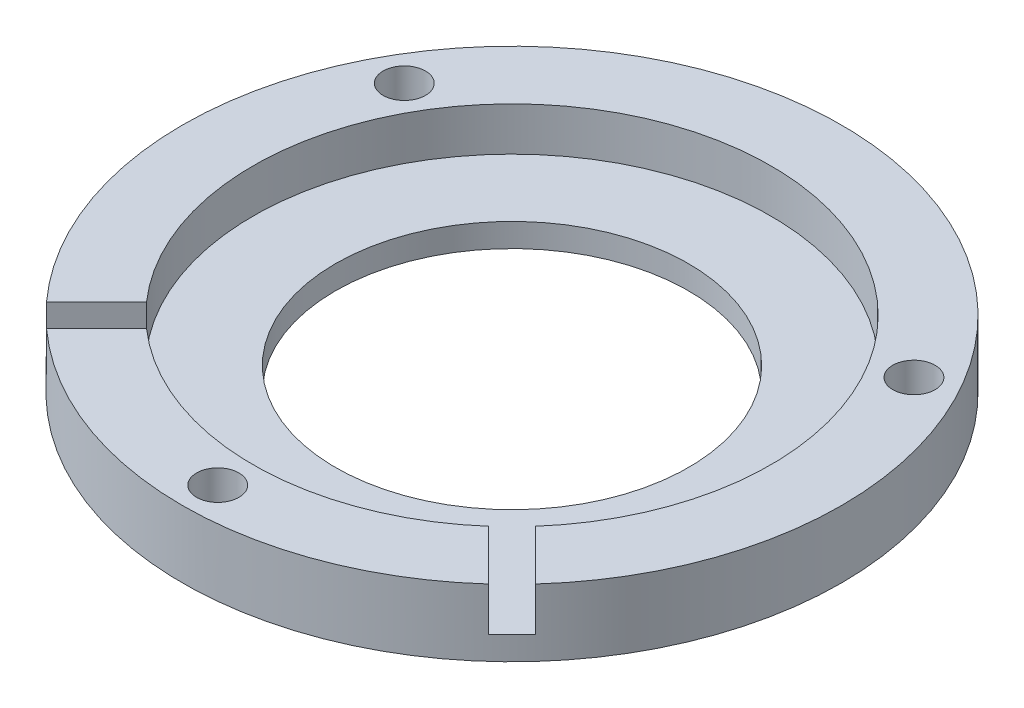
ISO-10303-21;
HEADER;
FILE_DESCRIPTION(('STEP AP214'),'2;1');
FILE_NAME('part.step','',(''),(''),'','','');
FILE_SCHEMA(('AUTOMOTIVE_DESIGN { 1 0 10303 214 1 1 1 1 }'));
ENDSEC;
DATA;
#1=APPLICATION_CONTEXT('core data for automotive mechanical design processes');
#2=APPLICATION_PROTOCOL_DEFINITION('international standard','automotive_design',2000,#1);
#3=PRODUCT_CONTEXT('',#1,'mechanical');
#4=PRODUCT('Part','Part','',(#3));
#5=PRODUCT_RELATED_PRODUCT_CATEGORY('part','',(#4));
#6=PRODUCT_DEFINITION_FORMATION('','',#4);
#7=PRODUCT_DEFINITION_CONTEXT('part definition',#1,'design');
#8=PRODUCT_DEFINITION('design','',#6,#7);
#9=PRODUCT_DEFINITION_SHAPE('','',#8);
#10=(LENGTH_UNIT() NAMED_UNIT(*) SI_UNIT(.MILLI.,.METRE.));
#11=(NAMED_UNIT(*) PLANE_ANGLE_UNIT() SI_UNIT($,.RADIAN.));
#12=(NAMED_UNIT(*) SI_UNIT($,.STERADIAN.) SOLID_ANGLE_UNIT());
#13=UNCERTAINTY_MEASURE_WITH_UNIT(LENGTH_MEASURE(1.E-05),#10,'distance_accuracy_value','');
#14=(GEOMETRIC_REPRESENTATION_CONTEXT(3) GLOBAL_UNCERTAINTY_ASSIGNED_CONTEXT((#13)) GLOBAL_UNIT_ASSIGNED_CONTEXT((#10,
#11,#12)) REPRESENTATION_CONTEXT('',''));
#15=CARTESIAN_POINT('',(0.,0.,0.));
#16=DIRECTION('',(0.,0.,1.));
#17=DIRECTION('',(1.,0.,0.));
#18=AXIS2_PLACEMENT_3D('',#15,#16,#17);
#19=CARTESIAN_POINT('',(0.,2.85,0.));
#20=DIRECTION('',(0.,-1.,0.));
#21=DIRECTION('',(1.,0.,0.));
#22=AXIS2_PLACEMENT_3D('',#19,#20,#21);
#23=PLANE('',#22);
#24=CARTESIAN_POINT('',(-10.8253175473055,2.85,-6.25000000000005));
#25=DIRECTION('',(0.,1.,0.));
#26=DIRECTION('',(-1.,0.,0.));
#27=AXIS2_PLACEMENT_3D('',#24,#25,#26);
#28=CIRCLE('',#27,0.899999999999999);
#29=CARTESIAN_POINT('',(-11.7253175473055,2.85,-6.25000000000005));
#30=VERTEX_POINT('',#29);
#31=EDGE_CURVE('E229',#30,#30,#28,.T.);
#32=ORIENTED_EDGE('',*,*,#31,.F.);
#33=EDGE_LOOP('',(#32));
#34=FACE_BOUND('',#33,.T.);
#35=CARTESIAN_POINT('',(10.8253175473055,2.85,-6.2499999999999));
#36=DIRECTION('',(0.,1.,0.));
#37=DIRECTION('',(-1.,0.,0.));
#38=AXIS2_PLACEMENT_3D('',#35,#36,#37);
#39=CIRCLE('',#38,0.9);
#40=CARTESIAN_POINT('',(9.92531754730554,2.85,-6.2499999999999));
#41=VERTEX_POINT('',#40);
#42=EDGE_CURVE('E226',#41,#41,#39,.T.);
#43=ORIENTED_EDGE('',*,*,#42,.F.);
#44=EDGE_LOOP('',(#43));
#45=FACE_BOUND('',#44,.T.);
#46=DIRECTION('',(0.70710678118655,0.,-0.707106781186545));
#47=VECTOR('',#46,1.);
#48=CARTESIAN_POINT('',(-0.494974746830598,2.85,-0.494974746830602));
#49=LINE('',#48,#47);
#50=CARTESIAN_POINT('',(-10.3820875711085,2.85,9.39213807744724));
#51=VERTEX_POINT('',#50);
#52=CARTESIAN_POINT('',(-8.25738416659199,2.85,7.26743467293074));
#53=VERTEX_POINT('',#52);
#54=EDGE_CURVE('E212',#51,#53,#49,.T.);
#55=ORIENTED_EDGE('',*,*,#54,.T.);
#56=CARTESIAN_POINT('',(0.,2.85,0.));
#57=DIRECTION('',(0.,1.,0.));
#58=DIRECTION('',(-1.,0.,0.));
#59=AXIS2_PLACEMENT_3D('',#56,#57,#58);
#60=CIRCLE('',#59,11.);
#61=CARTESIAN_POINT('',(8.25738416659194,2.85,7.2674346729308));
#62=VERTEX_POINT('',#61);
#63=EDGE_CURVE('E122',#62,#53,#60,.T.);
#64=ORIENTED_EDGE('',*,*,#63,.F.);
#65=DIRECTION('',(-0.707106781186546,0.,-0.707106781186549));
#66=VECTOR('',#65,1.);
#67=CARTESIAN_POINT('',(0.494974746830585,2.85,-0.494974746830583));
#68=LINE('',#67,#66);
#69=CARTESIAN_POINT('',(10.3820875711084,2.85,9.39213807744731));
#70=VERTEX_POINT('',#69);
#71=EDGE_CURVE('E187',#70,#62,#68,.T.);
#72=ORIENTED_EDGE('',*,*,#71,.F.);
#73=CARTESIAN_POINT('',(0.,2.85,0.));
#74=DIRECTION('',(0.,1.,0.));
#75=DIRECTION('',(-1.,0.,0.));
#76=AXIS2_PLACEMENT_3D('',#73,#74,#75);
#77=CIRCLE('',#76,14.);
#78=EDGE_CURVE('E133',#70,#51,#77,.T.);
#79=ORIENTED_EDGE('',*,*,#78,.T.);
#80=EDGE_LOOP('',(#55,#64,#72,#79));
#81=FACE_BOUND('',#80,.T.);
#82=ADVANCED_FACE('F35',(#34,#45,#81),#23,.F.);
#83=CARTESIAN_POINT('',(0.,0.999999999999999,0.));
#84=DIRECTION('',(0.,1.,0.));
#85=DIRECTION('',(-1.,0.,0.));
#86=AXIS2_PLACEMENT_3D('',#83,#84,#85);
#87=CYLINDRICAL_SURFACE('',#86,11.);
#88=DIRECTION('',(0.,1.,0.));
#89=VECTOR('',#88,1.);
#90=CARTESIAN_POINT('',(-8.25738416659199,-3.40478437068753,7.26743467293074));
#91=LINE('',#90,#89);
#92=CARTESIAN_POINT('',(-8.25738416659199,1.,7.26743467293074));
#93=VERTEX_POINT('',#92);
#94=EDGE_CURVE('E110',#93,#53,#91,.T.);
#95=ORIENTED_EDGE('',*,*,#94,.F.);
#96=CARTESIAN_POINT('',(0.,1.,0.));
#97=DIRECTION('',(0.,1.,0.));
#98=DIRECTION('',(-1.,0.,0.));
#99=AXIS2_PLACEMENT_3D('',#96,#97,#98);
#100=CIRCLE('',#99,11.);
#101=CARTESIAN_POINT('',(8.25738416659194,0.999999999999999,7.2674346729308));
#102=VERTEX_POINT('',#101);
#103=EDGE_CURVE('E123',#102,#93,#100,.T.);
#104=ORIENTED_EDGE('',*,*,#103,.F.);
#105=DIRECTION('',(0.,1.,0.));
#106=VECTOR('',#105,1.);
#107=CARTESIAN_POINT('',(8.25738416659194,-3.40478437068754,7.2674346729308));
#108=LINE('',#107,#106);
#109=EDGE_CURVE('E198',#102,#62,#108,.T.);
#110=ORIENTED_EDGE('',*,*,#109,.T.);
#111=ORIENTED_EDGE('',*,*,#63,.T.);
#112=EDGE_LOOP('',(#95,#104,#110,#111));
#113=FACE_BOUND('',#112,.T.);
#114=ADVANCED_FACE('F150',(#113),#87,.F.);
#115=CARTESIAN_POINT('',(0.,1.,0.));
#116=DIRECTION('',(0.,-1.,0.));
#117=DIRECTION('',(1.,0.,0.));
#118=AXIS2_PLACEMENT_3D('',#115,#116,#117);
#119=PLANE('',#118);
#120=CARTESIAN_POINT('',(0.,1.,0.));
#121=DIRECTION('',(0.,1.,0.));
#122=DIRECTION('',(-1.,0.,0.));
#123=AXIS2_PLACEMENT_3D('',#120,#121,#122);
#124=CIRCLE('',#123,7.5);
#125=CARTESIAN_POINT('',(-7.5,1.,0.));
#126=VERTEX_POINT('',#125);
#127=EDGE_CURVE('E11',#126,#126,#124,.T.);
#128=ORIENTED_EDGE('',*,*,#127,.F.);
#129=EDGE_LOOP('',(#128));
#130=FACE_BOUND('',#129,.T.);
#131=ORIENTED_EDGE('',*,*,#103,.T.);
#132=DIRECTION('',(0.70710678118655,0.,-0.707106781186545));
#133=VECTOR('',#132,1.);
#134=CARTESIAN_POINT('',(-0.494974746830598,1.,-0.494974746830602));
#135=LINE('',#134,#133);
#136=CARTESIAN_POINT('',(-10.3820875711085,1.,9.39213807744724));
#137=VERTEX_POINT('',#136);
#138=EDGE_CURVE('E58',#137,#93,#135,.T.);
#139=ORIENTED_EDGE('',*,*,#138,.F.);
#140=CARTESIAN_POINT('',(0.,1.,0.));
#141=DIRECTION('',(0.,-1.,0.));
#142=DIRECTION('',(1.,0.,0.));
#143=AXIS2_PLACEMENT_3D('',#140,#141,#142);
#144=CIRCLE('',#143,14.);
#145=CARTESIAN_POINT('',(-9.39213807744735,1.,10.3820875711084));
#146=VERTEX_POINT('',#145);
#147=EDGE_CURVE('E117',#137,#146,#144,.F.);
#148=ORIENTED_EDGE('',*,*,#147,.T.);
#149=DIRECTION('',(0.707106781186551,0.,-0.707106781186544));
#150=VECTOR('',#149,1.);
#151=CARTESIAN_POINT('',(0.494974746830581,1.,0.494974746830586));
#152=LINE('',#151,#150);
#153=CARTESIAN_POINT('',(-7.26743467293083,1.,8.25738416659192));
#154=VERTEX_POINT('',#153);
#155=EDGE_CURVE('E102',#146,#154,#152,.T.);
#156=ORIENTED_EDGE('',*,*,#155,.T.);
#157=CARTESIAN_POINT('',(7.26743467293077,1.,8.25738416659196));
#158=VERTEX_POINT('',#157);
#159=EDGE_CURVE('E115',#154,#158,#100,.T.);
#160=ORIENTED_EDGE('',*,*,#159,.T.);
#161=DIRECTION('',(-0.707106781186546,0.,-0.707106781186549));
#162=VECTOR('',#161,1.);
#163=CARTESIAN_POINT('',(-0.494974746830584,1.,0.494974746830582));
#164=LINE('',#163,#162);
#165=CARTESIAN_POINT('',(9.39213807744728,0.999999999999999,10.3820875711085));
#166=VERTEX_POINT('',#165);
#167=EDGE_CURVE('E50',#166,#158,#164,.T.);
#168=ORIENTED_EDGE('',*,*,#167,.F.);
#169=CARTESIAN_POINT('',(0.,1.,0.));
#170=DIRECTION('',(0.,-1.,0.));
#171=DIRECTION('',(1.,0.,0.));
#172=AXIS2_PLACEMENT_3D('',#169,#170,#171);
#173=CIRCLE('',#172,14.);
#174=CARTESIAN_POINT('',(10.3820875711084,0.999999999999999,9.39213807744731));
#175=VERTEX_POINT('',#174);
#176=EDGE_CURVE('E189',#166,#175,#173,.F.);
#177=ORIENTED_EDGE('',*,*,#176,.T.);
#178=DIRECTION('',(-0.707106781186546,0.,-0.707106781186549));
#179=VECTOR('',#178,1.);
#180=CARTESIAN_POINT('',(0.494974746830585,1.,-0.494974746830583));
#181=LINE('',#180,#179);
#182=EDGE_CURVE('E195',#175,#102,#181,.T.);
#183=ORIENTED_EDGE('',*,*,#182,.T.);
#184=EDGE_LOOP('',(#131,#139,#148,#156,#160,#168,#177,#183));
#185=FACE_BOUND('',#184,.T.);
#186=ADVANCED_FACE('F37',(#130,#185),#119,.F.);
#187=CARTESIAN_POINT('',(0.,0.999999999999999,0.));
#188=DIRECTION('',(0.,1.,0.));
#189=DIRECTION('',(-1.,0.,0.));
#190=AXIS2_PLACEMENT_3D('',#187,#188,#189);
#191=CYLINDRICAL_SURFACE('',#190,7.5);
#192=CARTESIAN_POINT('',(0.,0.,0.));
#193=DIRECTION('',(0.,1.,0.));
#194=DIRECTION('',(-1.,0.,0.));
#195=AXIS2_PLACEMENT_3D('',#192,#193,#194);
#196=CIRCLE('',#195,7.5);
#197=CARTESIAN_POINT('',(-7.5,0.,0.));
#198=VERTEX_POINT('',#197);
#199=EDGE_CURVE('E43',#198,#198,#196,.T.);
#200=ORIENTED_EDGE('',*,*,#199,.F.);
#201=EDGE_LOOP('',(#200));
#202=FACE_BOUND('',#201,.T.);
#203=ORIENTED_EDGE('',*,*,#127,.T.);
#204=EDGE_LOOP('',(#203));
#205=FACE_BOUND('',#204,.T.);
#206=ADVANCED_FACE('F144',(#202,#205),#191,.F.);
#207=CARTESIAN_POINT('',(0.,0.,0.));
#208=DIRECTION('',(0.,1.,0.));
#209=DIRECTION('',(-1.,0.,0.));
#210=AXIS2_PLACEMENT_3D('',#207,#208,#209);
#211=PLANE('',#210);
#212=CARTESIAN_POINT('',(-10.8253175473055,0.,-6.25000000000005));
#213=DIRECTION('',(0.,1.,0.));
#214=DIRECTION('',(-1.,0.,0.));
#215=AXIS2_PLACEMENT_3D('',#212,#213,#214);
#216=CIRCLE('',#215,0.899999999999999);
#217=CARTESIAN_POINT('',(-11.7253175473055,0.,-6.25000000000005));
#218=VERTEX_POINT('',#217);
#219=EDGE_CURVE('E194',#218,#218,#216,.T.);
#220=ORIENTED_EDGE('',*,*,#219,.T.);
#221=EDGE_LOOP('',(#220));
#222=FACE_BOUND('',#221,.T.);
#223=CARTESIAN_POINT('',(10.8253175473055,0.,-6.2499999999999));
#224=DIRECTION('',(0.,1.,0.));
#225=DIRECTION('',(-1.,0.,0.));
#226=AXIS2_PLACEMENT_3D('',#223,#224,#225);
#227=CIRCLE('',#226,0.9);
#228=CARTESIAN_POINT('',(9.92531754730554,0.,-6.2499999999999));
#229=VERTEX_POINT('',#228);
#230=EDGE_CURVE('E223',#229,#229,#227,.T.);
#231=ORIENTED_EDGE('',*,*,#230,.T.);
#232=EDGE_LOOP('',(#231));
#233=FACE_BOUND('',#232,.T.);
#234=CARTESIAN_POINT('',(0.,0.,12.5));
#235=DIRECTION('',(0.,1.,0.));
#236=DIRECTION('',(-1.,0.,0.));
#237=AXIS2_PLACEMENT_3D('',#234,#235,#236);
#238=CIRCLE('',#237,0.9);
#239=CARTESIAN_POINT('',(-0.899999999999998,0.,12.5));
#240=VERTEX_POINT('',#239);
#241=EDGE_CURVE('E219',#240,#240,#238,.T.);
#242=ORIENTED_EDGE('',*,*,#241,.T.);
#243=EDGE_LOOP('',(#242));
#244=FACE_BOUND('',#243,.T.);
#245=CARTESIAN_POINT('',(0.,0.,0.));
#246=DIRECTION('',(0.,1.,0.));
#247=DIRECTION('',(-1.,0.,0.));
#248=AXIS2_PLACEMENT_3D('',#245,#246,#247);
#249=CIRCLE('',#248,14.);
#250=CARTESIAN_POINT('',(-14.,0.,0.));
#251=VERTEX_POINT('',#250);
#252=EDGE_CURVE('E137',#251,#251,#249,.T.);
#253=ORIENTED_EDGE('',*,*,#252,.F.);
#254=EDGE_LOOP('',(#253));
#255=FACE_BOUND('',#254,.T.);
#256=ORIENTED_EDGE('',*,*,#199,.T.);
#257=EDGE_LOOP('',(#256));
#258=FACE_BOUND('',#257,.T.);
#259=ADVANCED_FACE('F142',(#222,#233,#244,#255,#258),#211,.F.);
#260=CARTESIAN_POINT('',(0.,0.999999999999999,0.));
#261=DIRECTION('',(0.,1.,0.));
#262=DIRECTION('',(-1.,0.,0.));
#263=AXIS2_PLACEMENT_3D('',#260,#261,#262);
#264=CYLINDRICAL_SURFACE('',#263,14.);
#265=CARTESIAN_POINT('',(-9.39213807744735,2.85,10.3820875711084));
#266=VERTEX_POINT('',#265);
#267=CARTESIAN_POINT('',(9.39213807744728,2.85,10.3820875711085));
#268=VERTEX_POINT('',#267);
#269=EDGE_CURVE('E136',#266,#268,#77,.T.);
#270=ORIENTED_EDGE('',*,*,#269,.F.);
#271=DIRECTION('',(0.,1.,0.));
#272=VECTOR('',#271,1.);
#273=CARTESIAN_POINT('',(-9.39213807744735,-3.40478437068753,10.3820875711084));
#274=LINE('',#273,#272);
#275=EDGE_CURVE('E128',#146,#266,#274,.T.);
#276=ORIENTED_EDGE('',*,*,#275,.F.);
#277=ORIENTED_EDGE('',*,*,#147,.F.);
#278=DIRECTION('',(0.,1.,0.));
#279=VECTOR('',#278,1.);
#280=CARTESIAN_POINT('',(-10.3820875711085,-3.40478437068753,9.39213807744724));
#281=LINE('',#280,#279);
#282=EDGE_CURVE('E211',#137,#51,#281,.T.);
#283=ORIENTED_EDGE('',*,*,#282,.T.);
#284=ORIENTED_EDGE('',*,*,#78,.F.);
#285=DIRECTION('',(0.,1.,0.));
#286=VECTOR('',#285,1.);
#287=CARTESIAN_POINT('',(10.3820875711084,-3.40478437068754,9.39213807744731));
#288=LINE('',#287,#286);
#289=EDGE_CURVE('E192',#175,#70,#288,.T.);
#290=ORIENTED_EDGE('',*,*,#289,.F.);
#291=ORIENTED_EDGE('',*,*,#176,.F.);
#292=DIRECTION('',(0.,1.,0.));
#293=VECTOR('',#292,1.);
#294=CARTESIAN_POINT('',(9.39213807744728,-3.40478437068754,10.3820875711085));
#295=LINE('',#294,#293);
#296=EDGE_CURVE('E130',#166,#268,#295,.T.);
#297=ORIENTED_EDGE('',*,*,#296,.T.);
#298=EDGE_LOOP('',(#270,#276,#277,#283,#284,#290,#291,#297));
#299=FACE_BOUND('',#298,.T.);
#300=ORIENTED_EDGE('',*,*,#252,.T.);
#301=EDGE_LOOP('',(#300));
#302=FACE_BOUND('',#301,.T.);
#303=ADVANCED_FACE('F166',(#299,#302),#264,.T.);
#304=CARTESIAN_POINT('',(0.,2.85,12.5));
#305=DIRECTION('',(0.,1.,0.));
#306=DIRECTION('',(-1.,0.,0.));
#307=AXIS2_PLACEMENT_3D('',#304,#305,#306);
#308=CIRCLE('',#307,0.9);
#309=CARTESIAN_POINT('',(-0.899999999999998,2.85,12.5));
#310=VERTEX_POINT('',#309);
#311=EDGE_CURVE('E177',#310,#310,#308,.T.);
#312=ORIENTED_EDGE('',*,*,#311,.F.);
#313=EDGE_LOOP('',(#312));
#314=FACE_BOUND('',#313,.T.);
#315=CARTESIAN_POINT('',(-7.26743467293083,2.85,8.25738416659192));
#316=VERTEX_POINT('',#315);
#317=CARTESIAN_POINT('',(7.26743467293077,2.85,8.25738416659196));
#318=VERTEX_POINT('',#317);
#319=EDGE_CURVE('E126',#316,#318,#60,.T.);
#320=ORIENTED_EDGE('',*,*,#319,.F.);
#321=DIRECTION('',(0.707106781186551,0.,-0.707106781186544));
#322=VECTOR('',#321,1.);
#323=CARTESIAN_POINT('',(0.494974746830581,2.85,0.494974746830586));
#324=LINE('',#323,#322);
#325=EDGE_CURVE('E105',#266,#316,#324,.T.);
#326=ORIENTED_EDGE('',*,*,#325,.F.);
#327=ORIENTED_EDGE('',*,*,#269,.T.);
#328=DIRECTION('',(-0.707106781186546,0.,-0.707106781186549));
#329=VECTOR('',#328,1.);
#330=CARTESIAN_POINT('',(-0.494974746830583,2.85,0.494974746830582));
#331=LINE('',#330,#329);
#332=EDGE_CURVE('E181',#268,#318,#331,.T.);
#333=ORIENTED_EDGE('',*,*,#332,.T.);
#334=EDGE_LOOP('',(#320,#326,#327,#333));
#335=FACE_BOUND('',#334,.T.);
#336=ADVANCED_FACE('F159',(#314,#335),#23,.F.);
#337=ORIENTED_EDGE('',*,*,#159,.F.);
#338=DIRECTION('',(0.,1.,0.));
#339=VECTOR('',#338,1.);
#340=CARTESIAN_POINT('',(-7.26743467293083,-3.40478437068753,8.25738416659192));
#341=LINE('',#340,#339);
#342=EDGE_CURVE('E99',#154,#316,#341,.T.);
#343=ORIENTED_EDGE('',*,*,#342,.T.);
#344=ORIENTED_EDGE('',*,*,#319,.T.);
#345=DIRECTION('',(0.,1.,0.));
#346=VECTOR('',#345,1.);
#347=CARTESIAN_POINT('',(7.26743467293077,-3.40478437068754,8.25738416659196));
#348=LINE('',#347,#346);
#349=EDGE_CURVE('E121',#158,#318,#348,.T.);
#350=ORIENTED_EDGE('',*,*,#349,.F.);
#351=EDGE_LOOP('',(#337,#343,#344,#350));
#352=FACE_BOUND('',#351,.T.);
#353=ADVANCED_FACE('F120',(#352),#87,.F.);
#354=CARTESIAN_POINT('',(0.494974746830585,-3.40478437068754,-0.494974746830583));
#355=DIRECTION('',(0.707106781186549,0.,-0.707106781186546));
#356=DIRECTION('',(-0.707106781186546,0.,-0.707106781186549));
#357=AXIS2_PLACEMENT_3D('',#354,#355,#356);
#358=PLANE('',#357);
#359=ORIENTED_EDGE('',*,*,#289,.T.);
#360=ORIENTED_EDGE('',*,*,#71,.T.);
#361=ORIENTED_EDGE('',*,*,#109,.F.);
#362=ORIENTED_EDGE('',*,*,#182,.F.);
#363=EDGE_LOOP('',(#359,#360,#361,#362));
#364=FACE_BOUND('',#363,.T.);
#365=ADVANCED_FACE('F172',(#364),#358,.F.);
#366=CARTESIAN_POINT('',(-0.494974746830584,-3.40478437068754,0.494974746830582));
#367=DIRECTION('',(0.707106781186549,0.,-0.707106781186546));
#368=DIRECTION('',(-0.707106781186546,0.,-0.707106781186549));
#369=AXIS2_PLACEMENT_3D('',#366,#367,#368);
#370=PLANE('',#369);
#371=ORIENTED_EDGE('',*,*,#167,.T.);
#372=ORIENTED_EDGE('',*,*,#349,.T.);
#373=ORIENTED_EDGE('',*,*,#332,.F.);
#374=ORIENTED_EDGE('',*,*,#296,.F.);
#375=EDGE_LOOP('',(#371,#372,#373,#374));
#376=FACE_BOUND('',#375,.T.);
#377=ADVANCED_FACE('F257',(#376),#370,.T.);
#378=CARTESIAN_POINT('',(0.494974746830581,-3.40478437068754,0.494974746830586));
#379=DIRECTION('',(0.707106781186544,0.,0.707106781186551));
#380=DIRECTION('',(0.707106781186551,0.,-0.707106781186544));
#381=AXIS2_PLACEMENT_3D('',#378,#379,#380);
#382=PLANE('',#381);
#383=ORIENTED_EDGE('',*,*,#275,.T.);
#384=ORIENTED_EDGE('',*,*,#325,.T.);
#385=ORIENTED_EDGE('',*,*,#342,.F.);
#386=ORIENTED_EDGE('',*,*,#155,.F.);
#387=EDGE_LOOP('',(#383,#384,#385,#386));
#388=FACE_BOUND('',#387,.T.);
#389=ADVANCED_FACE('F101',(#388),#382,.F.);
#390=CARTESIAN_POINT('',(-0.494974746830598,-3.40478437068754,-0.494974746830602));
#391=DIRECTION('',(0.707106781186545,0.,0.70710678118655));
#392=DIRECTION('',(0.70710678118655,0.,-0.707106781186545));
#393=AXIS2_PLACEMENT_3D('',#390,#391,#392);
#394=PLANE('',#393);
#395=ORIENTED_EDGE('',*,*,#138,.T.);
#396=ORIENTED_EDGE('',*,*,#94,.T.);
#397=ORIENTED_EDGE('',*,*,#54,.F.);
#398=ORIENTED_EDGE('',*,*,#282,.F.);
#399=EDGE_LOOP('',(#395,#396,#397,#398));
#400=FACE_BOUND('',#399,.T.);
#401=ADVANCED_FACE('F251',(#400),#394,.T.);
#402=CARTESIAN_POINT('',(0.,0.,12.5));
#403=DIRECTION('',(0.,1.,0.));
#404=DIRECTION('',(-1.,0.,0.));
#405=AXIS2_PLACEMENT_3D('',#402,#403,#404);
#406=CYLINDRICAL_SURFACE('',#405,0.9);
#407=CARTESIAN_POINT('',(-0.899999999999998,0.,12.5));
#408=CARTESIAN_POINT('',(-0.899999999999998,0.0296875,12.5));
#409=CARTESIAN_POINT('',(-0.899999999999998,0.059375,12.5));
#410=CARTESIAN_POINT('',(-0.899999999999998,0.11875,12.5));
#411=CARTESIAN_POINT('',(-0.899999999999998,0.1484375,12.5));
#412=CARTESIAN_POINT('',(-0.899999999999998,0.2078125,12.5));
#413=CARTESIAN_POINT('',(-0.899999999999998,0.2375,12.5));
#414=CARTESIAN_POINT('',(-0.899999999999998,0.296875,12.5));
#415=CARTESIAN_POINT('',(-0.899999999999998,0.3265625,12.5));
#416=CARTESIAN_POINT('',(-0.899999999999998,0.3859375,12.5));
#417=CARTESIAN_POINT('',(-0.899999999999998,0.415625,12.5));
#418=CARTESIAN_POINT('',(-0.899999999999998,0.475,12.5));
#419=CARTESIAN_POINT('',(-0.899999999999998,0.5046875,12.5));
#420=CARTESIAN_POINT('',(-0.899999999999998,0.5640625,12.5));
#421=CARTESIAN_POINT('',(-0.899999999999998,0.59375,12.5));
#422=CARTESIAN_POINT('',(-0.899999999999998,0.653125,12.5));
#423=CARTESIAN_POINT('',(-0.899999999999998,0.6828125,12.5));
#424=CARTESIAN_POINT('',(-0.899999999999998,0.7421875,12.5));
#425=CARTESIAN_POINT('',(-0.899999999999998,0.771875,12.5));
#426=CARTESIAN_POINT('',(-0.899999999999998,0.83125,12.5));
#427=CARTESIAN_POINT('',(-0.899999999999998,0.8609375,12.5));
#428=CARTESIAN_POINT('',(-0.899999999999998,0.9203125,12.5));
#429=CARTESIAN_POINT('',(-0.899999999999998,0.95,12.5));
#430=CARTESIAN_POINT('',(-0.899999999999998,1.009375,12.5));
#431=CARTESIAN_POINT('',(-0.899999999999998,1.0390625,12.5));
#432=CARTESIAN_POINT('',(-0.899999999999998,1.0984375,12.5));
#433=CARTESIAN_POINT('',(-0.899999999999998,1.128125,12.5));
#434=CARTESIAN_POINT('',(-0.899999999999998,1.1875,12.5));
#435=CARTESIAN_POINT('',(-0.899999999999998,1.2171875,12.5));
#436=CARTESIAN_POINT('',(-0.899999999999998,1.2765625,12.5));
#437=CARTESIAN_POINT('',(-0.899999999999998,1.30625,12.5));
#438=CARTESIAN_POINT('',(-0.899999999999998,1.365625,12.5));
#439=CARTESIAN_POINT('',(-0.899999999999998,1.3953125,12.5));
#440=CARTESIAN_POINT('',(-0.899999999999998,1.4546875,12.5));
#441=CARTESIAN_POINT('',(-0.899999999999998,1.484375,12.5));
#442=CARTESIAN_POINT('',(-0.899999999999998,1.54375,12.5));
#443=CARTESIAN_POINT('',(-0.899999999999998,1.5734375,12.5));
#444=CARTESIAN_POINT('',(-0.899999999999998,1.6328125,12.5));
#445=CARTESIAN_POINT('',(-0.899999999999998,1.6625,12.5));
#446=CARTESIAN_POINT('',(-0.899999999999998,1.721875,12.5));
#447=CARTESIAN_POINT('',(-0.899999999999998,1.7515625,12.5));
#448=CARTESIAN_POINT('',(-0.899999999999998,1.8109375,12.5));
#449=CARTESIAN_POINT('',(-0.899999999999998,1.840625,12.5));
#450=CARTESIAN_POINT('',(-0.899999999999998,1.9,12.5));
#451=CARTESIAN_POINT('',(-0.899999999999998,1.9296875,12.5));
#452=CARTESIAN_POINT('',(-0.899999999999998,1.9890625,12.5));
#453=CARTESIAN_POINT('',(-0.899999999999998,2.01875,12.5));
#454=CARTESIAN_POINT('',(-0.899999999999998,2.078125,12.5));
#455=CARTESIAN_POINT('',(-0.899999999999998,2.1078125,12.5));
#456=CARTESIAN_POINT('',(-0.899999999999998,2.1671875,12.5));
#457=CARTESIAN_POINT('',(-0.899999999999998,2.196875,12.5));
#458=CARTESIAN_POINT('',(-0.899999999999998,2.25625,12.5));
#459=CARTESIAN_POINT('',(-0.899999999999998,2.2859375,12.5));
#460=CARTESIAN_POINT('',(-0.899999999999998,2.3453125,12.5));
#461=CARTESIAN_POINT('',(-0.899999999999998,2.375,12.5));
#462=CARTESIAN_POINT('',(-0.899999999999998,2.434375,12.5));
#463=CARTESIAN_POINT('',(-0.899999999999998,2.4640625,12.5));
#464=CARTESIAN_POINT('',(-0.899999999999998,2.5234375,12.5));
#465=CARTESIAN_POINT('',(-0.899999999999998,2.553125,12.5));
#466=CARTESIAN_POINT('',(-0.899999999999998,2.6125,12.5));
#467=CARTESIAN_POINT('',(-0.899999999999998,2.6421875,12.5));
#468=CARTESIAN_POINT('',(-0.899999999999998,2.7015625,12.5));
#469=CARTESIAN_POINT('',(-0.899999999999998,2.73125,12.5));
#470=CARTESIAN_POINT('',(-0.899999999999998,2.790625,12.5));
#471=CARTESIAN_POINT('',(-0.899999999999998,2.8203125,12.5));
#472=CARTESIAN_POINT('',(-0.899999999999998,2.85,12.5));
#473=B_SPLINE_CURVE_WITH_KNOTS('',3,(#407,#408,#409,#410,#411,#412,#413,#414,#415,#416,#417,
#418,#419,#420,#421,#422,#423,#424,#425,#426,#427,#428,#429,#430,#431,#432,#433,#434,#435,#436,
#437,#438,#439,#440,#441,#442,#443,#444,#445,#446,#447,#448,#449,#450,#451,#452,#453,#454,#455,
#456,#457,#458,#459,#460,#461,#462,#463,#464,#465,#466,#467,#468,#469,#470,#471,#472),
.UNSPECIFIED.,.F.,.F.,(4,2,2,2,2,2,2,2,2,2,2,2,2,2,2,2,2,2,2,2,2,2,2,2,2,2,2,2,2,2,2,2,4),(0.,
0.0890625,0.178125,0.2671875,0.35625,0.4453125,0.534375,0.6234375,0.7125,0.8015625,0.890625,
0.9796875,1.06875,1.1578125,1.246875,1.3359375,1.425,1.5140625,1.603125,1.6921875,1.78125,
1.8703125,1.959375,2.0484375,2.1375,2.2265625,2.315625,2.4046875,2.49375,2.5828125,2.671875,
2.7609375,2.85),.UNSPECIFIED.);
#474=EDGE_CURVE('BSEAM245',#240,#310,#473,.T.);
#475=ORIENTED_EDGE('',*,*,#241,.F.);
#476=ORIENTED_EDGE('',*,*,#311,.T.);
#477=ORIENTED_EDGE('',*,*,#474,.T.);
#478=ORIENTED_EDGE('',*,*,#474,.F.);
#479=EDGE_LOOP('',(#475,#477,#476,#478));
#480=FACE_BOUND('',#479,.T.);
#481=ADVANCED_FACE('F245',(#480),#406,.F.);
#482=CARTESIAN_POINT('',(10.8253175473055,0.,-6.2499999999999));
#483=DIRECTION('',(0.,1.,0.));
#484=DIRECTION('',(-1.,0.,0.));
#485=AXIS2_PLACEMENT_3D('',#482,#483,#484);
#486=CYLINDRICAL_SURFACE('',#485,0.9);
#487=CARTESIAN_POINT('',(9.92531754730554,0.,-6.2499999999999));
#488=CARTESIAN_POINT('',(9.92531754730554,0.0296874999999996,-6.2499999999999));
#489=CARTESIAN_POINT('',(9.92531754730554,0.0593749999999996,-6.2499999999999));
#490=CARTESIAN_POINT('',(9.92531754730554,0.11875,-6.2499999999999));
#491=CARTESIAN_POINT('',(9.92531754730554,0.1484375,-6.2499999999999));
#492=CARTESIAN_POINT('',(9.92531754730554,0.2078125,-6.2499999999999));
#493=CARTESIAN_POINT('',(9.92531754730554,0.2375,-6.2499999999999));
#494=CARTESIAN_POINT('',(9.92531754730554,0.296875,-6.2499999999999));
#495=CARTESIAN_POINT('',(9.92531754730554,0.3265625,-6.2499999999999));
#496=CARTESIAN_POINT('',(9.92531754730554,0.3859375,-6.2499999999999));
#497=CARTESIAN_POINT('',(9.92531754730554,0.415625,-6.2499999999999));
#498=CARTESIAN_POINT('',(9.92531754730554,0.475,-6.2499999999999));
#499=CARTESIAN_POINT('',(9.92531754730554,0.5046875,-6.2499999999999));
#500=CARTESIAN_POINT('',(9.92531754730554,0.5640625,-6.2499999999999));
#501=CARTESIAN_POINT('',(9.92531754730554,0.59375,-6.2499999999999));
#502=CARTESIAN_POINT('',(9.92531754730554,0.653125,-6.2499999999999));
#503=CARTESIAN_POINT('',(9.92531754730554,0.6828125,-6.2499999999999));
#504=CARTESIAN_POINT('',(9.92531754730554,0.7421875,-6.2499999999999));
#505=CARTESIAN_POINT('',(9.92531754730554,0.771875,-6.2499999999999));
#506=CARTESIAN_POINT('',(9.92531754730554,0.83125,-6.2499999999999));
#507=CARTESIAN_POINT('',(9.92531754730554,0.8609375,-6.2499999999999));
#508=CARTESIAN_POINT('',(9.92531754730554,0.9203125,-6.2499999999999));
#509=CARTESIAN_POINT('',(9.92531754730554,0.95,-6.2499999999999));
#510=CARTESIAN_POINT('',(9.92531754730554,1.009375,-6.2499999999999));
#511=CARTESIAN_POINT('',(9.92531754730554,1.0390625,-6.2499999999999));
#512=CARTESIAN_POINT('',(9.92531754730554,1.0984375,-6.2499999999999));
#513=CARTESIAN_POINT('',(9.92531754730554,1.128125,-6.2499999999999));
#514=CARTESIAN_POINT('',(9.92531754730554,1.1875,-6.2499999999999));
#515=CARTESIAN_POINT('',(9.92531754730554,1.2171875,-6.2499999999999));
#516=CARTESIAN_POINT('',(9.92531754730554,1.2765625,-6.2499999999999));
#517=CARTESIAN_POINT('',(9.92531754730554,1.30625,-6.2499999999999));
#518=CARTESIAN_POINT('',(9.92531754730554,1.365625,-6.2499999999999));
#519=CARTESIAN_POINT('',(9.92531754730554,1.3953125,-6.2499999999999));
#520=CARTESIAN_POINT('',(9.92531754730554,1.4546875,-6.2499999999999));
#521=CARTESIAN_POINT('',(9.92531754730554,1.484375,-6.2499999999999));
#522=CARTESIAN_POINT('',(9.92531754730554,1.54375,-6.2499999999999));
#523=CARTESIAN_POINT('',(9.92531754730554,1.5734375,-6.2499999999999));
#524=CARTESIAN_POINT('',(9.92531754730554,1.6328125,-6.2499999999999));
#525=CARTESIAN_POINT('',(9.92531754730554,1.6625,-6.2499999999999));
#526=CARTESIAN_POINT('',(9.92531754730554,1.721875,-6.2499999999999));
#527=CARTESIAN_POINT('',(9.92531754730554,1.7515625,-6.2499999999999));
#528=CARTESIAN_POINT('',(9.92531754730554,1.8109375,-6.2499999999999));
#529=CARTESIAN_POINT('',(9.92531754730554,1.840625,-6.2499999999999));
#530=CARTESIAN_POINT('',(9.92531754730554,1.9,-6.2499999999999));
#531=CARTESIAN_POINT('',(9.92531754730554,1.9296875,-6.2499999999999));
#532=CARTESIAN_POINT('',(9.92531754730554,1.9890625,-6.2499999999999));
#533=CARTESIAN_POINT('',(9.92531754730554,2.01875,-6.2499999999999));
#534=CARTESIAN_POINT('',(9.92531754730554,2.078125,-6.2499999999999));
#535=CARTESIAN_POINT('',(9.92531754730554,2.1078125,-6.2499999999999));
#536=CARTESIAN_POINT('',(9.92531754730554,2.1671875,-6.2499999999999));
#537=CARTESIAN_POINT('',(9.92531754730554,2.196875,-6.2499999999999));
#538=CARTESIAN_POINT('',(9.92531754730554,2.25625,-6.2499999999999));
#539=CARTESIAN_POINT('',(9.92531754730554,2.2859375,-6.2499999999999));
#540=CARTESIAN_POINT('',(9.92531754730554,2.3453125,-6.2499999999999));
#541=CARTESIAN_POINT('',(9.92531754730554,2.375,-6.2499999999999));
#542=CARTESIAN_POINT('',(9.92531754730554,2.434375,-6.2499999999999));
#543=CARTESIAN_POINT('',(9.92531754730554,2.4640625,-6.2499999999999));
#544=CARTESIAN_POINT('',(9.92531754730554,2.5234375,-6.2499999999999));
#545=CARTESIAN_POINT('',(9.92531754730554,2.553125,-6.2499999999999));
#546=CARTESIAN_POINT('',(9.92531754730554,2.6125,-6.2499999999999));
#547=CARTESIAN_POINT('',(9.92531754730554,2.6421875,-6.2499999999999));
#548=CARTESIAN_POINT('',(9.92531754730554,2.7015625,-6.2499999999999));
#549=CARTESIAN_POINT('',(9.92531754730554,2.73125,-6.2499999999999));
#550=CARTESIAN_POINT('',(9.92531754730554,2.790625,-6.2499999999999));
#551=CARTESIAN_POINT('',(9.92531754730554,2.8203125,-6.2499999999999));
#552=CARTESIAN_POINT('',(9.92531754730554,2.85,-6.2499999999999));
#553=B_SPLINE_CURVE_WITH_KNOTS('',3,(#487,#488,#489,#490,#491,#492,#493,#494,#495,#496,#497,
#498,#499,#500,#501,#502,#503,#504,#505,#506,#507,#508,#509,#510,#511,#512,#513,#514,#515,#516,
#517,#518,#519,#520,#521,#522,#523,#524,#525,#526,#527,#528,#529,#530,#531,#532,#533,#534,#535,
#536,#537,#538,#539,#540,#541,#542,#543,#544,#545,#546,#547,#548,#549,#550,#551,#552),
.UNSPECIFIED.,.F.,.F.,(4,2,2,2,2,2,2,2,2,2,2,2,2,2,2,2,2,2,2,2,2,2,2,2,2,2,2,2,2,2,2,2,4),(0.,
0.0890625,0.178125,0.2671875,0.35625,0.4453125,0.534375,0.6234375,0.7125,0.8015625,0.890625,
0.9796875,1.06875,1.1578125,1.246875,1.3359375,1.425,1.5140625,1.603125,1.6921875,1.78125,
1.8703125,1.959375,2.0484375,2.1375,2.2265625,2.315625,2.4046875,2.49375,2.5828125,2.671875,
2.7609375,2.85),.UNSPECIFIED.);
#554=EDGE_CURVE('BSEAM240',#229,#41,#553,.T.);
#555=ORIENTED_EDGE('',*,*,#230,.F.);
#556=ORIENTED_EDGE('',*,*,#42,.T.);
#557=ORIENTED_EDGE('',*,*,#554,.T.);
#558=ORIENTED_EDGE('',*,*,#554,.F.);
#559=EDGE_LOOP('',(#555,#557,#556,#558));
#560=FACE_BOUND('',#559,.T.);
#561=ADVANCED_FACE('F240',(#560),#486,.F.);
#562=CARTESIAN_POINT('',(-10.8253175473055,0.,-6.25000000000005));
#563=DIRECTION('',(0.,1.,0.));
#564=DIRECTION('',(-1.,0.,0.));
#565=AXIS2_PLACEMENT_3D('',#562,#563,#564);
#566=CYLINDRICAL_SURFACE('',#565,0.899999999999999);
#567=CARTESIAN_POINT('',(-11.7253175473055,0.,-6.25000000000005));
#568=CARTESIAN_POINT('',(-11.7253175473055,0.0296875000000004,-6.25000000000005));
#569=CARTESIAN_POINT('',(-11.7253175473055,0.0593750000000005,-6.25000000000005));
#570=CARTESIAN_POINT('',(-11.7253175473055,0.11875,-6.25000000000005));
#571=CARTESIAN_POINT('',(-11.7253175473055,0.1484375,-6.25000000000005));
#572=CARTESIAN_POINT('',(-11.7253175473055,0.2078125,-6.25000000000005));
#573=CARTESIAN_POINT('',(-11.7253175473055,0.237500000000001,-6.25000000000005));
#574=CARTESIAN_POINT('',(-11.7253175473055,0.296875000000001,-6.25000000000005));
#575=CARTESIAN_POINT('',(-11.7253175473055,0.326562500000001,-6.25000000000005));
#576=CARTESIAN_POINT('',(-11.7253175473055,0.385937500000001,-6.25000000000005));
#577=CARTESIAN_POINT('',(-11.7253175473055,0.415625000000001,-6.25000000000005));
#578=CARTESIAN_POINT('',(-11.7253175473055,0.475000000000001,-6.25000000000005));
#579=CARTESIAN_POINT('',(-11.7253175473055,0.504687500000001,-6.25000000000005));
#580=CARTESIAN_POINT('',(-11.7253175473055,0.5640625,-6.25000000000005));
#581=CARTESIAN_POINT('',(-11.7253175473055,0.593750000000001,-6.25000000000005));
#582=CARTESIAN_POINT('',(-11.7253175473055,0.653125000000001,-6.25000000000005));
#583=CARTESIAN_POINT('',(-11.7253175473055,0.682812500000001,-6.25000000000005));
#584=CARTESIAN_POINT('',(-11.7253175473055,0.742187500000001,-6.25000000000005));
#585=CARTESIAN_POINT('',(-11.7253175473055,0.771875000000001,-6.25000000000005));
#586=CARTESIAN_POINT('',(-11.7253175473055,0.831250000000001,-6.25000000000005));
#587=CARTESIAN_POINT('',(-11.7253175473055,0.860937500000001,-6.25000000000005));
#588=CARTESIAN_POINT('',(-11.7253175473055,0.920312500000001,-6.25000000000005));
#589=CARTESIAN_POINT('',(-11.7253175473055,0.950000000000001,-6.25000000000005));
#590=CARTESIAN_POINT('',(-11.7253175473055,1.009375,-6.25000000000005));
#591=CARTESIAN_POINT('',(-11.7253175473055,1.0390625,-6.25000000000005));
#592=CARTESIAN_POINT('',(-11.7253175473055,1.0984375,-6.25000000000005));
#593=CARTESIAN_POINT('',(-11.7253175473055,1.128125,-6.25000000000005));
#594=CARTESIAN_POINT('',(-11.7253175473055,1.1875,-6.25000000000005));
#595=CARTESIAN_POINT('',(-11.7253175473055,1.2171875,-6.25000000000005));
#596=CARTESIAN_POINT('',(-11.7253175473055,1.2765625,-6.25000000000005));
#597=CARTESIAN_POINT('',(-11.7253175473055,1.30625,-6.25000000000005));
#598=CARTESIAN_POINT('',(-11.7253175473055,1.365625,-6.25000000000005));
#599=CARTESIAN_POINT('',(-11.7253175473055,1.3953125,-6.25000000000005));
#600=CARTESIAN_POINT('',(-11.7253175473055,1.4546875,-6.25000000000005));
#601=CARTESIAN_POINT('',(-11.7253175473055,1.484375,-6.25000000000005));
#602=CARTESIAN_POINT('',(-11.7253175473055,1.54375,-6.25000000000005));
#603=CARTESIAN_POINT('',(-11.7253175473055,1.5734375,-6.25000000000005));
#604=CARTESIAN_POINT('',(-11.7253175473055,1.6328125,-6.25000000000005));
#605=CARTESIAN_POINT('',(-11.7253175473055,1.6625,-6.25000000000005));
#606=CARTESIAN_POINT('',(-11.7253175473055,1.721875,-6.25000000000005));
#607=CARTESIAN_POINT('',(-11.7253175473055,1.7515625,-6.25000000000005));
#608=CARTESIAN_POINT('',(-11.7253175473055,1.8109375,-6.25000000000005));
#609=CARTESIAN_POINT('',(-11.7253175473055,1.840625,-6.25000000000005));
#610=CARTESIAN_POINT('',(-11.7253175473055,1.9,-6.25000000000005));
#611=CARTESIAN_POINT('',(-11.7253175473055,1.9296875,-6.25000000000005));
#612=CARTESIAN_POINT('',(-11.7253175473055,1.9890625,-6.25000000000005));
#613=CARTESIAN_POINT('',(-11.7253175473055,2.01875,-6.25000000000005));
#614=CARTESIAN_POINT('',(-11.7253175473055,2.078125,-6.25000000000005));
#615=CARTESIAN_POINT('',(-11.7253175473055,2.1078125,-6.25000000000005));
#616=CARTESIAN_POINT('',(-11.7253175473055,2.1671875,-6.25000000000005));
#617=CARTESIAN_POINT('',(-11.7253175473055,2.196875,-6.25000000000005));
#618=CARTESIAN_POINT('',(-11.7253175473055,2.25625,-6.25000000000005));
#619=CARTESIAN_POINT('',(-11.7253175473055,2.2859375,-6.25000000000005));
#620=CARTESIAN_POINT('',(-11.7253175473055,2.3453125,-6.25000000000005));
#621=CARTESIAN_POINT('',(-11.7253175473055,2.375,-6.25000000000005));
#622=CARTESIAN_POINT('',(-11.7253175473055,2.434375,-6.25000000000005));
#623=CARTESIAN_POINT('',(-11.7253175473055,2.4640625,-6.25000000000005));
#624=CARTESIAN_POINT('',(-11.7253175473055,2.5234375,-6.25000000000005));
#625=CARTESIAN_POINT('',(-11.7253175473055,2.553125,-6.25000000000005));
#626=CARTESIAN_POINT('',(-11.7253175473055,2.6125,-6.25000000000005));
#627=CARTESIAN_POINT('',(-11.7253175473055,2.6421875,-6.25000000000005));
#628=CARTESIAN_POINT('',(-11.7253175473055,2.7015625,-6.25000000000005));
#629=CARTESIAN_POINT('',(-11.7253175473055,2.73125,-6.25000000000005));
#630=CARTESIAN_POINT('',(-11.7253175473055,2.790625,-6.25000000000005));
#631=CARTESIAN_POINT('',(-11.7253175473055,2.8203125,-6.25000000000005));
#632=CARTESIAN_POINT('',(-11.7253175473055,2.85,-6.25000000000005));
#633=B_SPLINE_CURVE_WITH_KNOTS('',3,(#567,#568,#569,#570,#571,#572,#573,#574,#575,#576,#577,
#578,#579,#580,#581,#582,#583,#584,#585,#586,#587,#588,#589,#590,#591,#592,#593,#594,#595,#596,
#597,#598,#599,#600,#601,#602,#603,#604,#605,#606,#607,#608,#609,#610,#611,#612,#613,#614,#615,
#616,#617,#618,#619,#620,#621,#622,#623,#624,#625,#626,#627,#628,#629,#630,#631,#632),
.UNSPECIFIED.,.F.,.F.,(4,2,2,2,2,2,2,2,2,2,2,2,2,2,2,2,2,2,2,2,2,2,2,2,2,2,2,2,2,2,2,2,4),(0.,
0.0890625,0.178125,0.2671875,0.35625,0.4453125,0.534375,0.6234375,0.7125,0.8015625,0.890625,
0.9796875,1.06875,1.1578125,1.246875,1.3359375,1.425,1.5140625,1.603125,1.6921875,1.78125,
1.8703125,1.959375,2.0484375,2.1375,2.2265625,2.315625,2.4046875,2.49375,2.5828125,2.671875,
2.7609375,2.85),.UNSPECIFIED.);
#634=EDGE_CURVE('BSEAM237',#218,#30,#633,.T.);
#635=ORIENTED_EDGE('',*,*,#219,.F.);
#636=ORIENTED_EDGE('',*,*,#31,.T.);
#637=ORIENTED_EDGE('',*,*,#634,.T.);
#638=ORIENTED_EDGE('',*,*,#634,.F.);
#639=EDGE_LOOP('',(#635,#637,#636,#638));
#640=FACE_BOUND('',#639,.T.);
#641=ADVANCED_FACE('F237',(#640),#566,.F.);
#642=CLOSED_SHELL('',(#82,#114,#186,#206,#259,#303,#336,#353,#365,#377,#389,#401,#481,#561,#641));
#643=MANIFOLD_SOLID_BREP('B2',#642);
#644=ADVANCED_BREP_SHAPE_REPRESENTATION('',(#18,#643),#14);
#645=SHAPE_DEFINITION_REPRESENTATION(#9,#644);
ENDSEC;
END-ISO-10303-21;
